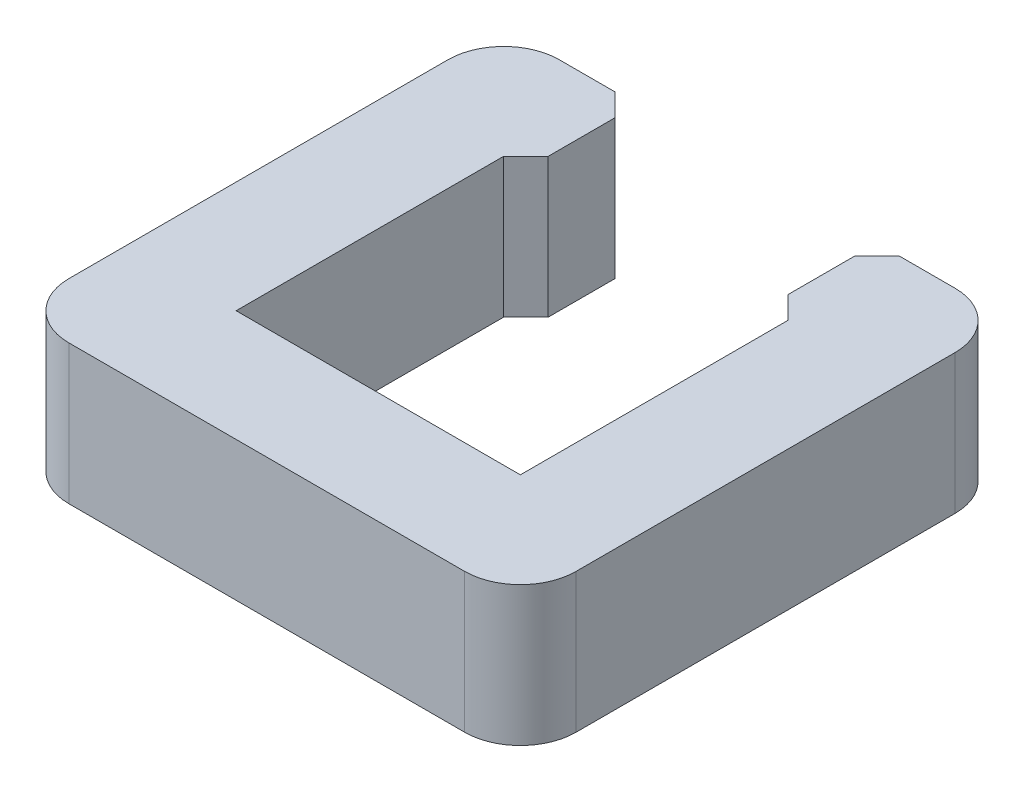
ISO-10303-21;
HEADER;
FILE_DESCRIPTION(('STEP AP214'),'2;1');
FILE_NAME('part.step','',(''),(''),'','','');
FILE_SCHEMA(('AUTOMOTIVE_DESIGN { 1 0 10303 214 1 1 1 1 }'));
ENDSEC;
DATA;
#1=APPLICATION_CONTEXT('core data for automotive mechanical design processes');
#2=APPLICATION_PROTOCOL_DEFINITION('international standard','automotive_design',2000,#1);
#3=PRODUCT_CONTEXT('',#1,'mechanical');
#4=PRODUCT('Part','Part','',(#3));
#5=PRODUCT_RELATED_PRODUCT_CATEGORY('part','',(#4));
#6=PRODUCT_DEFINITION_FORMATION('','',#4);
#7=PRODUCT_DEFINITION_CONTEXT('part definition',#1,'design');
#8=PRODUCT_DEFINITION('design','',#6,#7);
#9=PRODUCT_DEFINITION_SHAPE('','',#8);
#10=(LENGTH_UNIT() NAMED_UNIT(*) SI_UNIT(.MILLI.,.METRE.));
#11=(NAMED_UNIT(*) PLANE_ANGLE_UNIT() SI_UNIT($,.RADIAN.));
#12=(NAMED_UNIT(*) SI_UNIT($,.STERADIAN.) SOLID_ANGLE_UNIT());
#13=UNCERTAINTY_MEASURE_WITH_UNIT(LENGTH_MEASURE(1.E-05),#10,'distance_accuracy_value','');
#14=(GEOMETRIC_REPRESENTATION_CONTEXT(3) GLOBAL_UNCERTAINTY_ASSIGNED_CONTEXT((#13)) GLOBAL_UNIT_ASSIGNED_CONTEXT((#10,
#11,#12)) REPRESENTATION_CONTEXT('',''));
#15=CARTESIAN_POINT('',(0.,0.,0.));
#16=DIRECTION('',(0.,0.,1.));
#17=DIRECTION('',(1.,0.,0.));
#18=AXIS2_PLACEMENT_3D('',#15,#16,#17);
#19=CARTESIAN_POINT('',(-2.7305,3.175,-3.556));
#20=DIRECTION('',(-0.707106781186548,0.,-0.707106781186547));
#21=DIRECTION('',(-0.707106781186547,0.,0.707106781186548));
#22=AXIS2_PLACEMENT_3D('',#19,#20,#21);
#23=PLANE('',#22);
#24=DIRECTION('',(0.707106781186547,0.,-0.707106781186548));
#25=VECTOR('',#24,1.);
#26=CARTESIAN_POINT('',(-2.7305,0.,-3.556));
#27=LINE('',#26,#25);
#28=CARTESIAN_POINT('',(-3.2385,0.,-3.048));
#29=VERTEX_POINT('',#28);
#30=CARTESIAN_POINT('',(-2.7305,0.,-3.556));
#31=VERTEX_POINT('',#30);
#32=EDGE_CURVE('E199',#29,#31,#27,.T.);
#33=ORIENTED_EDGE('',*,*,#32,.T.);
#34=DIRECTION('',(0.,-1.,0.));
#35=VECTOR('',#34,1.);
#36=CARTESIAN_POINT('',(-2.7305,3.175,-3.556));
#37=LINE('',#36,#35);
#38=CARTESIAN_POINT('',(-2.7305,3.175,-3.556));
#39=VERTEX_POINT('',#38);
#40=EDGE_CURVE('E178',#39,#31,#37,.T.);
#41=ORIENTED_EDGE('',*,*,#40,.F.);
#42=DIRECTION('',(0.707106781186547,0.,-0.707106781186548));
#43=VECTOR('',#42,1.);
#44=CARTESIAN_POINT('',(-2.7305,3.175,-3.556));
#45=LINE('',#44,#43);
#46=CARTESIAN_POINT('',(-3.2385,3.175,-3.048));
#47=VERTEX_POINT('',#46);
#48=EDGE_CURVE('E185',#47,#39,#45,.T.);
#49=ORIENTED_EDGE('',*,*,#48,.F.);
#50=DIRECTION('',(0.,-1.,0.));
#51=VECTOR('',#50,1.);
#52=CARTESIAN_POINT('',(-3.2385,3.175,-3.048));
#53=LINE('',#52,#51);
#54=EDGE_CURVE('E299',#47,#29,#53,.T.);
#55=ORIENTED_EDGE('',*,*,#54,.T.);
#56=EDGE_LOOP('',(#33,#41,#49,#55));
#57=FACE_BOUND('',#56,.T.);
#58=ADVANCED_FACE('F47',(#57),#23,.F.);
#59=CARTESIAN_POINT('',(-2.7305,3.175,-5.08));
#60=DIRECTION('',(-1.,0.,0.));
#61=DIRECTION('',(0.,0.,1.));
#62=AXIS2_PLACEMENT_3D('',#59,#60,#61);
#63=PLANE('',#62);
#64=DIRECTION('',(0.,0.,-1.));
#65=VECTOR('',#64,1.);
#66=CARTESIAN_POINT('',(-2.7305,0.,-5.08));
#67=LINE('',#66,#65);
#68=CARTESIAN_POINT('',(-2.7305,0.,-5.08));
#69=VERTEX_POINT('',#68);
#70=EDGE_CURVE('E340',#31,#69,#67,.T.);
#71=ORIENTED_EDGE('',*,*,#70,.T.);
#72=DIRECTION('',(0.,-1.,0.));
#73=VECTOR('',#72,1.);
#74=CARTESIAN_POINT('',(-2.7305,3.175,-5.08));
#75=LINE('',#74,#73);
#76=CARTESIAN_POINT('',(-2.7305,3.175,-5.08));
#77=VERTEX_POINT('',#76);
#78=EDGE_CURVE('E181',#77,#69,#75,.T.);
#79=ORIENTED_EDGE('',*,*,#78,.F.);
#80=DIRECTION('',(0.,0.,-1.));
#81=VECTOR('',#80,1.);
#82=CARTESIAN_POINT('',(-2.7305,3.175,-5.08));
#83=LINE('',#82,#81);
#84=EDGE_CURVE('E174',#39,#77,#83,.T.);
#85=ORIENTED_EDGE('',*,*,#84,.F.);
#86=ORIENTED_EDGE('',*,*,#40,.T.);
#87=EDGE_LOOP('',(#71,#79,#85,#86));
#88=FACE_BOUND('',#87,.T.);
#89=ADVANCED_FACE('F176',(#88),#63,.F.);
#90=CARTESIAN_POINT('',(-3.2385,3.175,-5.588));
#91=DIRECTION('',(-0.707106781186547,0.,0.707106781186548));
#92=DIRECTION('',(0.707106781186548,0.,0.707106781186547));
#93=AXIS2_PLACEMENT_3D('',#90,#91,#92);
#94=PLANE('',#93);
#95=DIRECTION('',(-0.707106781186548,0.,-0.707106781186547));
#96=VECTOR('',#95,1.);
#97=CARTESIAN_POINT('',(-3.2385,0.,-5.588));
#98=LINE('',#97,#96);
#99=CARTESIAN_POINT('',(-3.2385,0.,-5.588));
#100=VERTEX_POINT('',#99);
#101=EDGE_CURVE('E337',#69,#100,#98,.T.);
#102=ORIENTED_EDGE('',*,*,#101,.T.);
#103=DIRECTION('',(0.,-1.,0.));
#104=VECTOR('',#103,1.);
#105=CARTESIAN_POINT('',(-3.2385,3.175,-5.588));
#106=LINE('',#105,#104);
#107=CARTESIAN_POINT('',(-3.2385,3.175,-5.588));
#108=VERTEX_POINT('',#107);
#109=EDGE_CURVE('E207',#108,#100,#106,.T.);
#110=ORIENTED_EDGE('',*,*,#109,.F.);
#111=DIRECTION('',(-0.707106781186548,0.,-0.707106781186547));
#112=VECTOR('',#111,1.);
#113=CARTESIAN_POINT('',(-3.2385,3.175,-5.588));
#114=LINE('',#113,#112);
#115=EDGE_CURVE('E184',#77,#108,#114,.T.);
#116=ORIENTED_EDGE('',*,*,#115,.F.);
#117=ORIENTED_EDGE('',*,*,#78,.T.);
#118=EDGE_LOOP('',(#102,#110,#116,#117));
#119=FACE_BOUND('',#118,.T.);
#120=ADVANCED_FACE('F380',(#119),#94,.F.);
#121=CARTESIAN_POINT('',(-5.7785,3.175,-5.588));
#122=DIRECTION('',(0.,0.,1.));
#123=DIRECTION('',(1.,0.,0.));
#124=AXIS2_PLACEMENT_3D('',#121,#122,#123);
#125=PLANE('',#124);
#126=DIRECTION('',(-1.,0.,0.));
#127=VECTOR('',#126,1.);
#128=CARTESIAN_POINT('',(-5.7785,0.,-5.588));
#129=LINE('',#128,#127);
#130=CARTESIAN_POINT('',(-4.5085,0.,-5.588));
#131=VERTEX_POINT('',#130);
#132=EDGE_CURVE('E276',#100,#131,#129,.T.);
#133=ORIENTED_EDGE('',*,*,#132,.T.);
#134=DIRECTION('',(0.,-1.,0.));
#135=VECTOR('',#134,1.);
#136=CARTESIAN_POINT('',(-4.5085,3.175,-5.588));
#137=LINE('',#136,#135);
#138=CARTESIAN_POINT('',(-4.5085,3.175,-5.588));
#139=VERTEX_POINT('',#138);
#140=EDGE_CURVE('E226',#131,#139,#137,.F.);
#141=ORIENTED_EDGE('',*,*,#140,.T.);
#142=DIRECTION('',(-1.,0.,0.));
#143=VECTOR('',#142,1.);
#144=CARTESIAN_POINT('',(-5.7785,3.175,-5.588));
#145=LINE('',#144,#143);
#146=EDGE_CURVE('E334',#108,#139,#145,.T.);
#147=ORIENTED_EDGE('',*,*,#146,.F.);
#148=ORIENTED_EDGE('',*,*,#109,.T.);
#149=EDGE_LOOP('',(#133,#141,#147,#148));
#150=FACE_BOUND('',#149,.T.);
#151=ADVANCED_FACE('F332',(#150),#125,.F.);
#152=CARTESIAN_POINT('',(-5.7785,3.175,-5.588));
#153=DIRECTION('',(1.,0.,0.));
#154=DIRECTION('',(0.,0.,-1.));
#155=AXIS2_PLACEMENT_3D('',#152,#153,#154);
#156=PLANE('',#155);
#157=DIRECTION('',(0.,0.,1.));
#158=VECTOR('',#157,1.);
#159=CARTESIAN_POINT('',(-5.7785,3.175,-5.588));
#160=LINE('',#159,#158);
#161=CARTESIAN_POINT('',(-5.7785,3.175,-4.318));
#162=VERTEX_POINT('',#161);
#163=CARTESIAN_POINT('',(-5.7785,3.175,4.318));
#164=VERTEX_POINT('',#163);
#165=EDGE_CURVE('E372',#162,#164,#160,.T.);
#166=ORIENTED_EDGE('',*,*,#165,.F.);
#167=DIRECTION('',(0.,-1.,0.));
#168=VECTOR('',#167,1.);
#169=CARTESIAN_POINT('',(-5.7785,3.175,-4.318));
#170=LINE('',#169,#168);
#171=CARTESIAN_POINT('',(-5.7785,0.,-4.318));
#172=VERTEX_POINT('',#171);
#173=EDGE_CURVE('E205',#162,#172,#170,.T.);
#174=ORIENTED_EDGE('',*,*,#173,.T.);
#175=DIRECTION('',(0.,0.,1.));
#176=VECTOR('',#175,1.);
#177=CARTESIAN_POINT('',(-5.7785,0.,-5.588));
#178=LINE('',#177,#176);
#179=CARTESIAN_POINT('',(-5.7785,0.,4.318));
#180=VERTEX_POINT('',#179);
#181=EDGE_CURVE('E270',#172,#180,#178,.T.);
#182=ORIENTED_EDGE('',*,*,#181,.T.);
#183=DIRECTION('',(0.,-1.,0.));
#184=VECTOR('',#183,1.);
#185=CARTESIAN_POINT('',(-5.7785,3.175,4.318));
#186=LINE('',#185,#184);
#187=EDGE_CURVE('E201',#180,#164,#186,.F.);
#188=ORIENTED_EDGE('',*,*,#187,.T.);
#189=EDGE_LOOP('',(#166,#174,#182,#188));
#190=FACE_BOUND('',#189,.T.);
#191=ADVANCED_FACE('F388',(#190),#156,.F.);
#192=CARTESIAN_POINT('',(-5.7785,3.175,5.588));
#193=DIRECTION('',(0.,0.,-1.));
#194=DIRECTION('',(-1.,0.,0.));
#195=AXIS2_PLACEMENT_3D('',#192,#193,#194);
#196=PLANE('',#195);
#197=DIRECTION('',(1.,0.,0.));
#198=VECTOR('',#197,1.);
#199=CARTESIAN_POINT('',(-5.7785,0.,5.588));
#200=LINE('',#199,#198);
#201=CARTESIAN_POINT('',(-4.5085,0.,5.588));
#202=VERTEX_POINT('',#201);
#203=CARTESIAN_POINT('',(4.5085,0.,5.588));
#204=VERTEX_POINT('',#203);
#205=EDGE_CURVE('E257',#202,#204,#200,.T.);
#206=ORIENTED_EDGE('',*,*,#205,.T.);
#207=DIRECTION('',(0.,-1.,0.));
#208=VECTOR('',#207,1.);
#209=CARTESIAN_POINT('',(4.5085,3.175,5.588));
#210=LINE('',#209,#208);
#211=CARTESIAN_POINT('',(4.5085,3.175,5.588));
#212=VERTEX_POINT('',#211);
#213=EDGE_CURVE('E11',#204,#212,#210,.F.);
#214=ORIENTED_EDGE('',*,*,#213,.T.);
#215=DIRECTION('',(1.,0.,0.));
#216=VECTOR('',#215,1.);
#217=CARTESIAN_POINT('',(-5.7785,3.175,5.588));
#218=LINE('',#217,#216);
#219=CARTESIAN_POINT('',(-4.5085,3.175,5.588));
#220=VERTEX_POINT('',#219);
#221=EDGE_CURVE('E260',#220,#212,#218,.T.);
#222=ORIENTED_EDGE('',*,*,#221,.F.);
#223=DIRECTION('',(0.,-1.,0.));
#224=VECTOR('',#223,1.);
#225=CARTESIAN_POINT('',(-4.5085,3.175,5.588));
#226=LINE('',#225,#224);
#227=EDGE_CURVE('E56',#220,#202,#226,.T.);
#228=ORIENTED_EDGE('',*,*,#227,.T.);
#229=EDGE_LOOP('',(#206,#214,#222,#228));
#230=FACE_BOUND('',#229,.T.);
#231=ADVANCED_FACE('F256',(#230),#196,.F.);
#232=CARTESIAN_POINT('',(5.7785,3.175,-5.588));
#233=DIRECTION('',(-1.,0.,0.));
#234=DIRECTION('',(0.,0.,1.));
#235=AXIS2_PLACEMENT_3D('',#232,#233,#234);
#236=PLANE('',#235);
#237=DIRECTION('',(0.,0.,-1.));
#238=VECTOR('',#237,1.);
#239=CARTESIAN_POINT('',(5.7785,0.,-5.588));
#240=LINE('',#239,#238);
#241=CARTESIAN_POINT('',(5.7785,0.,4.318));
#242=VERTEX_POINT('',#241);
#243=CARTESIAN_POINT('',(5.7785,0.,-4.318));
#244=VERTEX_POINT('',#243);
#245=EDGE_CURVE('E269',#242,#244,#240,.T.);
#246=ORIENTED_EDGE('',*,*,#245,.T.);
#247=DIRECTION('',(0.,-1.,0.));
#248=VECTOR('',#247,1.);
#249=CARTESIAN_POINT('',(5.7785,3.175,-4.318));
#250=LINE('',#249,#248);
#251=CARTESIAN_POINT('',(5.7785,3.175,-4.318));
#252=VERTEX_POINT('',#251);
#253=EDGE_CURVE('E71',#244,#252,#250,.F.);
#254=ORIENTED_EDGE('',*,*,#253,.T.);
#255=DIRECTION('',(0.,0.,-1.));
#256=VECTOR('',#255,1.);
#257=CARTESIAN_POINT('',(5.7785,3.175,-5.588));
#258=LINE('',#257,#256);
#259=CARTESIAN_POINT('',(5.7785,3.175,4.318));
#260=VERTEX_POINT('',#259);
#261=EDGE_CURVE('E367',#260,#252,#258,.T.);
#262=ORIENTED_EDGE('',*,*,#261,.F.);
#263=DIRECTION('',(0.,-1.,0.));
#264=VECTOR('',#263,1.);
#265=CARTESIAN_POINT('',(5.7785,3.175,4.318));
#266=LINE('',#265,#264);
#267=EDGE_CURVE('E244',#260,#242,#266,.T.);
#268=ORIENTED_EDGE('',*,*,#267,.T.);
#269=EDGE_LOOP('',(#246,#254,#262,#268));
#270=FACE_BOUND('',#269,.T.);
#271=ADVANCED_FACE('F411',(#270),#236,.F.);
#272=CARTESIAN_POINT('',(3.2385,3.175,-5.588));
#273=DIRECTION('',(0.,0.,1.));
#274=DIRECTION('',(1.,0.,0.));
#275=AXIS2_PLACEMENT_3D('',#272,#273,#274);
#276=PLANE('',#275);
#277=DIRECTION('',(-1.,0.,0.));
#278=VECTOR('',#277,1.);
#279=CARTESIAN_POINT('',(3.2385,3.175,-5.588));
#280=LINE('',#279,#278);
#281=CARTESIAN_POINT('',(4.5085,3.175,-5.588));
#282=VERTEX_POINT('',#281);
#283=CARTESIAN_POINT('',(3.2385,3.175,-5.588));
#284=VERTEX_POINT('',#283);
#285=EDGE_CURVE('E364',#282,#284,#280,.T.);
#286=ORIENTED_EDGE('',*,*,#285,.F.);
#287=DIRECTION('',(0.,-1.,0.));
#288=VECTOR('',#287,1.);
#289=CARTESIAN_POINT('',(4.5085,3.175,-5.588));
#290=LINE('',#289,#288);
#291=CARTESIAN_POINT('',(4.5085,0.,-5.588));
#292=VERTEX_POINT('',#291);
#293=EDGE_CURVE('E240',#282,#292,#290,.T.);
#294=ORIENTED_EDGE('',*,*,#293,.T.);
#295=DIRECTION('',(-1.,0.,0.));
#296=VECTOR('',#295,1.);
#297=CARTESIAN_POINT('',(3.2385,0.,-5.588));
#298=LINE('',#297,#296);
#299=CARTESIAN_POINT('',(3.2385,0.,-5.588));
#300=VERTEX_POINT('',#299);
#301=EDGE_CURVE('E274',#292,#300,#298,.T.);
#302=ORIENTED_EDGE('',*,*,#301,.T.);
#303=DIRECTION('',(0.,-1.,0.));
#304=VECTOR('',#303,1.);
#305=CARTESIAN_POINT('',(3.2385,3.175,-5.588));
#306=LINE('',#305,#304);
#307=EDGE_CURVE('E322',#284,#300,#306,.T.);
#308=ORIENTED_EDGE('',*,*,#307,.F.);
#309=EDGE_LOOP('',(#286,#294,#302,#308));
#310=FACE_BOUND('',#309,.T.);
#311=ADVANCED_FACE('F416',(#310),#276,.F.);
#312=CARTESIAN_POINT('',(3.2385,3.175,-5.588));
#313=DIRECTION('',(0.707106781186547,0.,0.707106781186548));
#314=DIRECTION('',(0.707106781186548,0.,-0.707106781186547));
#315=AXIS2_PLACEMENT_3D('',#312,#313,#314);
#316=PLANE('',#315);
#317=DIRECTION('',(-0.707106781186548,0.,0.707106781186547));
#318=VECTOR('',#317,1.);
#319=CARTESIAN_POINT('',(3.2385,0.,-5.588));
#320=LINE('',#319,#318);
#321=CARTESIAN_POINT('',(2.7305,0.,-5.08));
#322=VERTEX_POINT('',#321);
#323=EDGE_CURVE('E282',#300,#322,#320,.T.);
#324=ORIENTED_EDGE('',*,*,#323,.T.);
#325=DIRECTION('',(0.,-1.,0.));
#326=VECTOR('',#325,1.);
#327=CARTESIAN_POINT('',(2.7305,3.175,-5.08));
#328=LINE('',#327,#326);
#329=CARTESIAN_POINT('',(2.7305,3.175,-5.08));
#330=VERTEX_POINT('',#329);
#331=EDGE_CURVE('E318',#330,#322,#328,.T.);
#332=ORIENTED_EDGE('',*,*,#331,.F.);
#333=DIRECTION('',(-0.707106781186548,0.,0.707106781186547));
#334=VECTOR('',#333,1.);
#335=CARTESIAN_POINT('',(3.2385,3.175,-5.588));
#336=LINE('',#335,#334);
#337=EDGE_CURVE('E361',#284,#330,#336,.T.);
#338=ORIENTED_EDGE('',*,*,#337,.F.);
#339=ORIENTED_EDGE('',*,*,#307,.T.);
#340=EDGE_LOOP('',(#324,#332,#338,#339));
#341=FACE_BOUND('',#340,.T.);
#342=ADVANCED_FACE('F423',(#341),#316,.F.);
#343=CARTESIAN_POINT('',(2.7305,3.175,-5.08));
#344=DIRECTION('',(1.,0.,0.));
#345=DIRECTION('',(0.,0.,-1.));
#346=AXIS2_PLACEMENT_3D('',#343,#344,#345);
#347=PLANE('',#346);
#348=DIRECTION('',(0.,0.,1.));
#349=VECTOR('',#348,1.);
#350=CARTESIAN_POINT('',(2.7305,0.,-5.08));
#351=LINE('',#350,#349);
#352=CARTESIAN_POINT('',(2.7305,0.,-3.556));
#353=VERTEX_POINT('',#352);
#354=EDGE_CURVE('E285',#322,#353,#351,.T.);
#355=ORIENTED_EDGE('',*,*,#354,.T.);
#356=DIRECTION('',(0.,-1.,0.));
#357=VECTOR('',#356,1.);
#358=CARTESIAN_POINT('',(2.7305,3.175,-3.556));
#359=LINE('',#358,#357);
#360=CARTESIAN_POINT('',(2.7305,3.175,-3.556));
#361=VERTEX_POINT('',#360);
#362=EDGE_CURVE('E314',#361,#353,#359,.T.);
#363=ORIENTED_EDGE('',*,*,#362,.F.);
#364=DIRECTION('',(0.,0.,1.));
#365=VECTOR('',#364,1.);
#366=CARTESIAN_POINT('',(2.7305,3.175,-5.08));
#367=LINE('',#366,#365);
#368=EDGE_CURVE('E358',#330,#361,#367,.T.);
#369=ORIENTED_EDGE('',*,*,#368,.F.);
#370=ORIENTED_EDGE('',*,*,#331,.T.);
#371=EDGE_LOOP('',(#355,#363,#369,#370));
#372=FACE_BOUND('',#371,.T.);
#373=ADVANCED_FACE('F426',(#372),#347,.F.);
#374=CARTESIAN_POINT('',(2.7305,3.175,-3.556));
#375=DIRECTION('',(0.707106781186548,0.,-0.707106781186547));
#376=DIRECTION('',(-0.707106781186547,0.,-0.707106781186548));
#377=AXIS2_PLACEMENT_3D('',#374,#375,#376);
#378=PLANE('',#377);
#379=DIRECTION('',(0.707106781186547,0.,0.707106781186548));
#380=VECTOR('',#379,1.);
#381=CARTESIAN_POINT('',(2.7305,0.,-3.556));
#382=LINE('',#381,#380);
#383=CARTESIAN_POINT('',(3.2385,0.,-3.048));
#384=VERTEX_POINT('',#383);
#385=EDGE_CURVE('E288',#353,#384,#382,.T.);
#386=ORIENTED_EDGE('',*,*,#385,.T.);
#387=DIRECTION('',(0.,-1.,0.));
#388=VECTOR('',#387,1.);
#389=CARTESIAN_POINT('',(3.2385,3.175,-3.048));
#390=LINE('',#389,#388);
#391=CARTESIAN_POINT('',(3.2385,3.175,-3.048));
#392=VERTEX_POINT('',#391);
#393=EDGE_CURVE('E310',#392,#384,#390,.T.);
#394=ORIENTED_EDGE('',*,*,#393,.F.);
#395=DIRECTION('',(0.707106781186547,0.,0.707106781186548));
#396=VECTOR('',#395,1.);
#397=CARTESIAN_POINT('',(2.7305,3.175,-3.556));
#398=LINE('',#397,#396);
#399=EDGE_CURVE('E355',#361,#392,#398,.T.);
#400=ORIENTED_EDGE('',*,*,#399,.F.);
#401=ORIENTED_EDGE('',*,*,#362,.T.);
#402=EDGE_LOOP('',(#386,#394,#400,#401));
#403=FACE_BOUND('',#402,.T.);
#404=ADVANCED_FACE('F431',(#403),#378,.F.);
#405=CARTESIAN_POINT('',(3.2385,3.175,-3.048));
#406=DIRECTION('',(1.,0.,0.));
#407=DIRECTION('',(0.,0.,-1.));
#408=AXIS2_PLACEMENT_3D('',#405,#406,#407);
#409=PLANE('',#408);
#410=DIRECTION('',(0.,0.,1.));
#411=VECTOR('',#410,1.);
#412=CARTESIAN_POINT('',(3.2385,0.,-3.048));
#413=LINE('',#412,#411);
#414=CARTESIAN_POINT('',(3.2385,0.,3.048));
#415=VERTEX_POINT('',#414);
#416=EDGE_CURVE('E291',#384,#415,#413,.T.);
#417=ORIENTED_EDGE('',*,*,#416,.T.);
#418=DIRECTION('',(0.,-1.,0.));
#419=VECTOR('',#418,1.);
#420=CARTESIAN_POINT('',(3.2385,3.175,3.048));
#421=LINE('',#420,#419);
#422=CARTESIAN_POINT('',(3.2385,3.175,3.048));
#423=VERTEX_POINT('',#422);
#424=EDGE_CURVE('E306',#423,#415,#421,.T.);
#425=ORIENTED_EDGE('',*,*,#424,.F.);
#426=DIRECTION('',(0.,0.,1.));
#427=VECTOR('',#426,1.);
#428=CARTESIAN_POINT('',(3.2385,3.175,-3.048));
#429=LINE('',#428,#427);
#430=EDGE_CURVE('E352',#392,#423,#429,.T.);
#431=ORIENTED_EDGE('',*,*,#430,.F.);
#432=ORIENTED_EDGE('',*,*,#393,.T.);
#433=EDGE_LOOP('',(#417,#425,#431,#432));
#434=FACE_BOUND('',#433,.T.);
#435=ADVANCED_FACE('F437',(#434),#409,.F.);
#436=CARTESIAN_POINT('',(-3.2385,3.175,3.048));
#437=DIRECTION('',(0.,0.,1.));
#438=DIRECTION('',(1.,0.,0.));
#439=AXIS2_PLACEMENT_3D('',#436,#437,#438);
#440=PLANE('',#439);
#441=DIRECTION('',(-1.,0.,0.));
#442=VECTOR('',#441,1.);
#443=CARTESIAN_POINT('',(-3.2385,0.,3.048));
#444=LINE('',#443,#442);
#445=CARTESIAN_POINT('',(-3.2385,0.,3.048));
#446=VERTEX_POINT('',#445);
#447=EDGE_CURVE('E294',#415,#446,#444,.T.);
#448=ORIENTED_EDGE('',*,*,#447,.T.);
#449=DIRECTION('',(0.,-1.,0.));
#450=VECTOR('',#449,1.);
#451=CARTESIAN_POINT('',(-3.2385,3.175,3.048));
#452=LINE('',#451,#450);
#453=CARTESIAN_POINT('',(-3.2385,3.175,3.048));
#454=VERTEX_POINT('',#453);
#455=EDGE_CURVE('E302',#454,#446,#452,.T.);
#456=ORIENTED_EDGE('',*,*,#455,.F.);
#457=DIRECTION('',(-1.,0.,0.));
#458=VECTOR('',#457,1.);
#459=CARTESIAN_POINT('',(-3.2385,3.175,3.048));
#460=LINE('',#459,#458);
#461=EDGE_CURVE('E349',#423,#454,#460,.T.);
#462=ORIENTED_EDGE('',*,*,#461,.F.);
#463=ORIENTED_EDGE('',*,*,#424,.T.);
#464=EDGE_LOOP('',(#448,#456,#462,#463));
#465=FACE_BOUND('',#464,.T.);
#466=ADVANCED_FACE('F441',(#465),#440,.F.);
#467=CARTESIAN_POINT('',(-3.2385,3.175,-3.048));
#468=DIRECTION('',(-1.,0.,0.));
#469=DIRECTION('',(0.,0.,1.));
#470=AXIS2_PLACEMENT_3D('',#467,#468,#469);
#471=PLANE('',#470);
#472=DIRECTION('',(0.,0.,-1.));
#473=VECTOR('',#472,1.);
#474=CARTESIAN_POINT('',(-3.2385,0.,-3.048));
#475=LINE('',#474,#473);
#476=EDGE_CURVE('E196',#446,#29,#475,.T.);
#477=ORIENTED_EDGE('',*,*,#476,.T.);
#478=ORIENTED_EDGE('',*,*,#54,.F.);
#479=DIRECTION('',(0.,0.,-1.));
#480=VECTOR('',#479,1.);
#481=CARTESIAN_POINT('',(-3.2385,3.175,-3.048));
#482=LINE('',#481,#480);
#483=EDGE_CURVE('E191',#454,#47,#482,.T.);
#484=ORIENTED_EDGE('',*,*,#483,.F.);
#485=ORIENTED_EDGE('',*,*,#455,.T.);
#486=EDGE_LOOP('',(#477,#478,#484,#485));
#487=FACE_BOUND('',#486,.T.);
#488=ADVANCED_FACE('F444',(#487),#471,.F.);
#489=CARTESIAN_POINT('',(0.,3.175,0.));
#490=DIRECTION('',(0.,1.,0.));
#491=DIRECTION('',(0.,0.,1.));
#492=AXIS2_PLACEMENT_3D('',#489,#490,#491);
#493=PLANE('',#492);
#494=ORIENTED_EDGE('',*,*,#146,.T.);
#495=CARTESIAN_POINT('',(-4.5085,3.175,-4.318));
#496=DIRECTION('',(0.,1.,0.));
#497=DIRECTION('',(0.,0.,1.));
#498=AXIS2_PLACEMENT_3D('',#495,#496,#497);
#499=CIRCLE('',#498,1.27);
#500=EDGE_CURVE('E237',#139,#162,#499,.T.);
#501=ORIENTED_EDGE('',*,*,#500,.T.);
#502=ORIENTED_EDGE('',*,*,#165,.T.);
#503=CARTESIAN_POINT('',(-4.5085,3.175,4.318));
#504=DIRECTION('',(0.,1.,0.));
#505=DIRECTION('',(0.,0.,1.));
#506=AXIS2_PLACEMENT_3D('',#503,#504,#505);
#507=CIRCLE('',#506,1.27);
#508=EDGE_CURVE('E229',#164,#220,#507,.T.);
#509=ORIENTED_EDGE('',*,*,#508,.T.);
#510=ORIENTED_EDGE('',*,*,#221,.T.);
#511=CARTESIAN_POINT('',(4.5085,3.175,4.318));
#512=DIRECTION('',(0.,1.,0.));
#513=DIRECTION('',(0.,0.,1.));
#514=AXIS2_PLACEMENT_3D('',#511,#512,#513);
#515=CIRCLE('',#514,1.27);
#516=EDGE_CURVE('E232',#212,#260,#515,.T.);
#517=ORIENTED_EDGE('',*,*,#516,.T.);
#518=ORIENTED_EDGE('',*,*,#261,.T.);
#519=CARTESIAN_POINT('',(4.5085,3.175,-4.318));
#520=DIRECTION('',(0.,1.,0.));
#521=DIRECTION('',(0.,0.,1.));
#522=AXIS2_PLACEMENT_3D('',#519,#520,#521);
#523=CIRCLE('',#522,1.27);
#524=EDGE_CURVE('E63',#252,#282,#523,.T.);
#525=ORIENTED_EDGE('',*,*,#524,.T.);
#526=ORIENTED_EDGE('',*,*,#285,.T.);
#527=ORIENTED_EDGE('',*,*,#337,.T.);
#528=ORIENTED_EDGE('',*,*,#368,.T.);
#529=ORIENTED_EDGE('',*,*,#399,.T.);
#530=ORIENTED_EDGE('',*,*,#430,.T.);
#531=ORIENTED_EDGE('',*,*,#461,.T.);
#532=ORIENTED_EDGE('',*,*,#483,.T.);
#533=ORIENTED_EDGE('',*,*,#48,.T.);
#534=ORIENTED_EDGE('',*,*,#84,.T.);
#535=ORIENTED_EDGE('',*,*,#115,.T.);
#536=EDGE_LOOP('',(#494,#501,#502,#509,#510,#517,#518,#525,#526,#527,#528,#529,#530,#531,#532,
#533,#534,#535));
#537=FACE_BOUND('',#536,.T.);
#538=ADVANCED_FACE('F189',(#537),#493,.T.);
#539=CARTESIAN_POINT('',(0.,0.,0.));
#540=DIRECTION('',(0.,1.,0.));
#541=DIRECTION('',(0.,0.,1.));
#542=AXIS2_PLACEMENT_3D('',#539,#540,#541);
#543=PLANE('',#542);
#544=ORIENTED_EDGE('',*,*,#181,.F.);
#545=CARTESIAN_POINT('',(-4.5085,0.,-4.318));
#546=DIRECTION('',(0.,1.,0.));
#547=DIRECTION('',(0.,0.,1.));
#548=AXIS2_PLACEMENT_3D('',#545,#546,#547);
#549=CIRCLE('',#548,1.27);
#550=EDGE_CURVE('E223',#172,#131,#549,.F.);
#551=ORIENTED_EDGE('',*,*,#550,.T.);
#552=ORIENTED_EDGE('',*,*,#132,.F.);
#553=ORIENTED_EDGE('',*,*,#101,.F.);
#554=ORIENTED_EDGE('',*,*,#70,.F.);
#555=ORIENTED_EDGE('',*,*,#32,.F.);
#556=ORIENTED_EDGE('',*,*,#476,.F.);
#557=ORIENTED_EDGE('',*,*,#447,.F.);
#558=ORIENTED_EDGE('',*,*,#416,.F.);
#559=ORIENTED_EDGE('',*,*,#385,.F.);
#560=ORIENTED_EDGE('',*,*,#354,.F.);
#561=ORIENTED_EDGE('',*,*,#323,.F.);
#562=ORIENTED_EDGE('',*,*,#301,.F.);
#563=CARTESIAN_POINT('',(4.5085,0.,-4.318));
#564=DIRECTION('',(0.,1.,0.));
#565=DIRECTION('',(0.,0.,1.));
#566=AXIS2_PLACEMENT_3D('',#563,#564,#565);
#567=CIRCLE('',#566,1.27);
#568=EDGE_CURVE('E220',#292,#244,#567,.F.);
#569=ORIENTED_EDGE('',*,*,#568,.T.);
#570=ORIENTED_EDGE('',*,*,#245,.F.);
#571=CARTESIAN_POINT('',(4.5085,0.,4.318));
#572=DIRECTION('',(0.,1.,0.));
#573=DIRECTION('',(0.,0.,1.));
#574=AXIS2_PLACEMENT_3D('',#571,#572,#573);
#575=CIRCLE('',#574,1.27);
#576=EDGE_CURVE('E217',#242,#204,#575,.F.);
#577=ORIENTED_EDGE('',*,*,#576,.T.);
#578=ORIENTED_EDGE('',*,*,#205,.F.);
#579=CARTESIAN_POINT('',(-4.5085,0.,4.318));
#580=DIRECTION('',(0.,1.,0.));
#581=DIRECTION('',(0.,0.,1.));
#582=AXIS2_PLACEMENT_3D('',#579,#580,#581);
#583=CIRCLE('',#582,1.27);
#584=EDGE_CURVE('E214',#202,#180,#583,.F.);
#585=ORIENTED_EDGE('',*,*,#584,.T.);
#586=EDGE_LOOP('',(#544,#551,#552,#553,#554,#555,#556,#557,#558,#559,#560,#561,#562,#569,#570,
#577,#578,#585));
#587=FACE_BOUND('',#586,.T.);
#588=ADVANCED_FACE('F265',(#587),#543,.F.);
#589=CARTESIAN_POINT('',(-4.5085,3.175,-4.318));
#590=DIRECTION('',(0.,-1.,0.));
#591=DIRECTION('',(0.,0.,-1.));
#592=AXIS2_PLACEMENT_3D('',#589,#590,#591);
#593=CYLINDRICAL_SURFACE('',#592,1.27);
#594=ORIENTED_EDGE('',*,*,#500,.F.);
#595=ORIENTED_EDGE('',*,*,#140,.F.);
#596=ORIENTED_EDGE('',*,*,#550,.F.);
#597=ORIENTED_EDGE('',*,*,#173,.F.);
#598=EDGE_LOOP('',(#594,#595,#596,#597));
#599=FACE_BOUND('',#598,.T.);
#600=ADVANCED_FACE('F396',(#599),#593,.T.);
#601=CARTESIAN_POINT('',(4.5085,3.175,-4.318));
#602=DIRECTION('',(0.,-1.,0.));
#603=DIRECTION('',(0.,0.,-1.));
#604=AXIS2_PLACEMENT_3D('',#601,#602,#603);
#605=CYLINDRICAL_SURFACE('',#604,1.27);
#606=ORIENTED_EDGE('',*,*,#524,.F.);
#607=ORIENTED_EDGE('',*,*,#253,.F.);
#608=ORIENTED_EDGE('',*,*,#568,.F.);
#609=ORIENTED_EDGE('',*,*,#293,.F.);
#610=EDGE_LOOP('',(#606,#607,#608,#609));
#611=FACE_BOUND('',#610,.T.);
#612=ADVANCED_FACE('F399',(#611),#605,.T.);
#613=CARTESIAN_POINT('',(4.5085,3.175,4.318));
#614=DIRECTION('',(0.,-1.,0.));
#615=DIRECTION('',(0.,0.,-1.));
#616=AXIS2_PLACEMENT_3D('',#613,#614,#615);
#617=CYLINDRICAL_SURFACE('',#616,1.27);
#618=ORIENTED_EDGE('',*,*,#516,.F.);
#619=ORIENTED_EDGE('',*,*,#213,.F.);
#620=ORIENTED_EDGE('',*,*,#576,.F.);
#621=ORIENTED_EDGE('',*,*,#267,.F.);
#622=EDGE_LOOP('',(#618,#619,#620,#621));
#623=FACE_BOUND('',#622,.T.);
#624=ADVANCED_FACE('F402',(#623),#617,.T.);
#625=CARTESIAN_POINT('',(-4.5085,3.175,4.318));
#626=DIRECTION('',(0.,-1.,0.));
#627=DIRECTION('',(0.,0.,-1.));
#628=AXIS2_PLACEMENT_3D('',#625,#626,#627);
#629=CYLINDRICAL_SURFACE('',#628,1.27);
#630=ORIENTED_EDGE('',*,*,#508,.F.);
#631=ORIENTED_EDGE('',*,*,#187,.F.);
#632=ORIENTED_EDGE('',*,*,#584,.F.);
#633=ORIENTED_EDGE('',*,*,#227,.F.);
#634=EDGE_LOOP('',(#630,#631,#632,#633));
#635=FACE_BOUND('',#634,.T.);
#636=ADVANCED_FACE('F49',(#635),#629,.T.);
#637=CLOSED_SHELL('',(#58,#89,#120,#151,#191,#231,#271,#311,#342,#373,#404,#435,#466,#488,#538,
#588,#600,#612,#624,#636));
#638=MANIFOLD_SOLID_BREP('B2',#637);
#639=ADVANCED_BREP_SHAPE_REPRESENTATION('',(#18,#638),#14);
#640=SHAPE_DEFINITION_REPRESENTATION(#9,#639);
ENDSEC;
END-ISO-10303-21;
